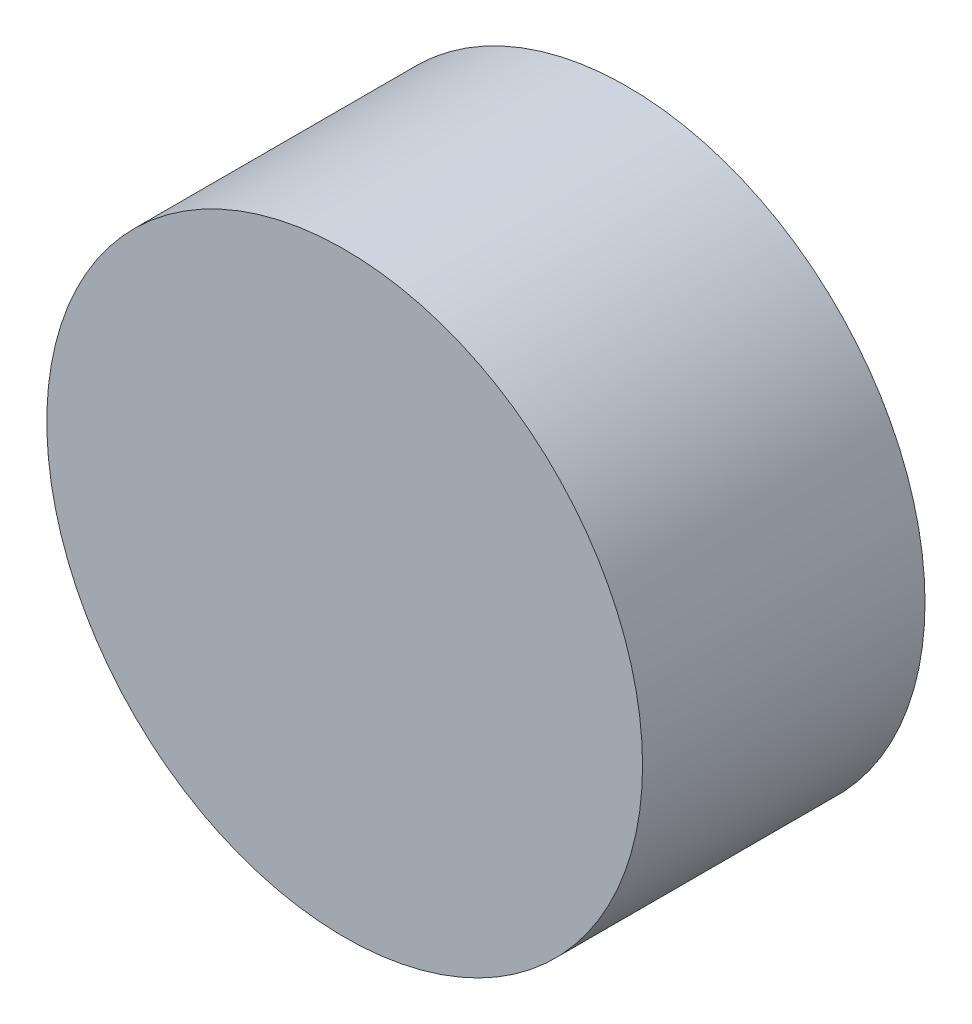
ISO-10303-21;
HEADER;
FILE_DESCRIPTION(('STEP AP214'),'2;1');
FILE_NAME('part.step','',(''),(''),'','','');
FILE_SCHEMA(('AUTOMOTIVE_DESIGN { 1 0 10303 214 1 1 1 1 }'));
ENDSEC;
DATA;
#1=APPLICATION_CONTEXT('core data for automotive mechanical design processes');
#2=APPLICATION_PROTOCOL_DEFINITION('international standard','automotive_design',2000,#1);
#3=PRODUCT_CONTEXT('',#1,'mechanical');
#4=PRODUCT('Part','Part','',(#3));
#5=PRODUCT_RELATED_PRODUCT_CATEGORY('part','',(#4));
#6=PRODUCT_DEFINITION_FORMATION('','',#4);
#7=PRODUCT_DEFINITION_CONTEXT('part definition',#1,'design');
#8=PRODUCT_DEFINITION('design','',#6,#7);
#9=PRODUCT_DEFINITION_SHAPE('','',#8);
#10=(LENGTH_UNIT() NAMED_UNIT(*) SI_UNIT(.MILLI.,.METRE.));
#11=(NAMED_UNIT(*) PLANE_ANGLE_UNIT() SI_UNIT($,.RADIAN.));
#12=(NAMED_UNIT(*) SI_UNIT($,.STERADIAN.) SOLID_ANGLE_UNIT());
#13=UNCERTAINTY_MEASURE_WITH_UNIT(LENGTH_MEASURE(1.E-05),#10,'distance_accuracy_value','');
#14=(GEOMETRIC_REPRESENTATION_CONTEXT(3) GLOBAL_UNCERTAINTY_ASSIGNED_CONTEXT((#13)) GLOBAL_UNIT_ASSIGNED_CONTEXT((#10,
#11,#12)) REPRESENTATION_CONTEXT('',''));
#15=CARTESIAN_POINT('',(0.,0.,0.));
#16=DIRECTION('',(0.,0.,1.));
#17=DIRECTION('',(1.,0.,0.));
#18=AXIS2_PLACEMENT_3D('',#15,#16,#17);
#19=CARTESIAN_POINT('',(0.,0.,27.5));
#20=DIRECTION('',(0.,0.,-1.));
#21=DIRECTION('',(-1.,0.,0.));
#22=AXIS2_PLACEMENT_3D('',#19,#20,#21);
#23=CYLINDRICAL_SURFACE('',#22,29.);
#24=CARTESIAN_POINT('',(0.,0.,27.5));
#25=DIRECTION('',(0.,0.,1.));
#26=DIRECTION('',(1.,0.,0.));
#27=AXIS2_PLACEMENT_3D('',#24,#25,#26);
#28=CIRCLE('',#27,29.);
#29=CARTESIAN_POINT('',(29.,0.,27.5));
#30=VERTEX_POINT('',#29);
#31=EDGE_CURVE('E10',#30,#30,#28,.T.);
#32=ORIENTED_EDGE('',*,*,#31,.F.);
#33=EDGE_LOOP('',(#32));
#34=FACE_BOUND('',#33,.T.);
#35=CARTESIAN_POINT('',(0.,0.,0.));
#36=DIRECTION('',(0.,0.,1.));
#37=DIRECTION('',(1.,0.,0.));
#38=AXIS2_PLACEMENT_3D('',#35,#36,#37);
#39=CIRCLE('',#38,29.);
#40=CARTESIAN_POINT('',(29.,0.,0.));
#41=VERTEX_POINT('',#40);
#42=EDGE_CURVE('E42',#41,#41,#39,.T.);
#43=ORIENTED_EDGE('',*,*,#42,.T.);
#44=EDGE_LOOP('',(#43));
#45=FACE_BOUND('',#44,.T.);
#46=ADVANCED_FACE('F39',(#34,#45),#23,.T.);
#47=CARTESIAN_POINT('',(0.,0.,27.5));
#48=DIRECTION('',(0.,0.,1.));
#49=DIRECTION('',(1.,0.,0.));
#50=AXIS2_PLACEMENT_3D('',#47,#48,#49);
#51=PLANE('',#50);
#52=ORIENTED_EDGE('',*,*,#31,.T.);
#53=EDGE_LOOP('',(#52));
#54=FACE_BOUND('',#53,.T.);
#55=ADVANCED_FACE('F54',(#54),#51,.T.);
#56=CARTESIAN_POINT('',(0.,0.,0.));
#57=DIRECTION('',(0.,0.,1.));
#58=DIRECTION('',(1.,0.,0.));
#59=AXIS2_PLACEMENT_3D('',#56,#57,#58);
#60=PLANE('',#59);
#61=ORIENTED_EDGE('',*,*,#42,.F.);
#62=EDGE_LOOP('',(#61));
#63=FACE_BOUND('',#62,.T.);
#64=ADVANCED_FACE('F52',(#63),#60,.F.);
#65=CLOSED_SHELL('',(#46,#55,#64));
#66=MANIFOLD_SOLID_BREP('B2',#65);
#67=ADVANCED_BREP_SHAPE_REPRESENTATION('',(#18,#66),#14);
#68=SHAPE_DEFINITION_REPRESENTATION(#9,#67);
ENDSEC;
END-ISO-10303-21;
